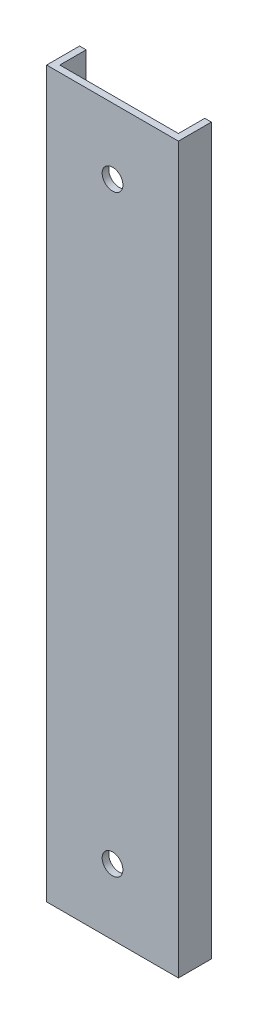
ISO-10303-21;
HEADER;
FILE_DESCRIPTION(('STEP AP214'),'2;1');
FILE_NAME('part.step','',(''),(''),'','','');
FILE_SCHEMA(('AUTOMOTIVE_DESIGN { 1 0 10303 214 1 1 1 1 }'));
ENDSEC;
DATA;
#1=APPLICATION_CONTEXT('core data for automotive mechanical design processes');
#2=APPLICATION_PROTOCOL_DEFINITION('international standard','automotive_design',2000,#1);
#3=PRODUCT_CONTEXT('',#1,'mechanical');
#4=PRODUCT('Part','Part','',(#3));
#5=PRODUCT_RELATED_PRODUCT_CATEGORY('part','',(#4));
#6=PRODUCT_DEFINITION_FORMATION('','',#4);
#7=PRODUCT_DEFINITION_CONTEXT('part definition',#1,'design');
#8=PRODUCT_DEFINITION('design','',#6,#7);
#9=PRODUCT_DEFINITION_SHAPE('','',#8);
#10=(LENGTH_UNIT() NAMED_UNIT(*) SI_UNIT(.MILLI.,.METRE.));
#11=(NAMED_UNIT(*) PLANE_ANGLE_UNIT() SI_UNIT($,.RADIAN.));
#12=(NAMED_UNIT(*) SI_UNIT($,.STERADIAN.) SOLID_ANGLE_UNIT());
#13=UNCERTAINTY_MEASURE_WITH_UNIT(LENGTH_MEASURE(1.E-05),#10,'distance_accuracy_value','');
#14=(GEOMETRIC_REPRESENTATION_CONTEXT(3) GLOBAL_UNCERTAINTY_ASSIGNED_CONTEXT((#13)) GLOBAL_UNIT_ASSIGNED_CONTEXT((#10,
#11,#12)) REPRESENTATION_CONTEXT('',''));
#15=CARTESIAN_POINT('',(0.,0.,0.));
#16=DIRECTION('',(0.,0.,1.));
#17=DIRECTION('',(1.,0.,0.));
#18=AXIS2_PLACEMENT_3D('',#15,#16,#17);
#19=CARTESIAN_POINT('',(22.86,279.4,-12.7));
#20=DIRECTION('',(0.,0.,1.));
#21=DIRECTION('',(1.,0.,0.));
#22=AXIS2_PLACEMENT_3D('',#19,#20,#21);
#23=PLANE('',#22);
#24=DIRECTION('',(-1.,0.,0.));
#25=VECTOR('',#24,1.);
#26=CARTESIAN_POINT('',(22.86,0.,-12.7));
#27=LINE('',#26,#25);
#28=CARTESIAN_POINT('',(25.4,0.,-12.7));
#29=VERTEX_POINT('',#28);
#30=CARTESIAN_POINT('',(22.86,0.,-12.7));
#31=VERTEX_POINT('',#30);
#32=EDGE_CURVE('E140',#29,#31,#27,.T.);
#33=ORIENTED_EDGE('',*,*,#32,.T.);
#34=DIRECTION('',(0.,-1.,0.));
#35=VECTOR('',#34,1.);
#36=CARTESIAN_POINT('',(22.86,279.4,-12.7));
#37=LINE('',#36,#35);
#38=CARTESIAN_POINT('',(22.86,279.4,-12.7));
#39=VERTEX_POINT('',#38);
#40=EDGE_CURVE('E11',#39,#31,#37,.T.);
#41=ORIENTED_EDGE('',*,*,#40,.F.);
#42=DIRECTION('',(-1.,0.,0.));
#43=VECTOR('',#42,1.);
#44=CARTESIAN_POINT('',(22.86,279.4,-12.7));
#45=LINE('',#44,#43);
#46=CARTESIAN_POINT('',(25.4,279.4,-12.7));
#47=VERTEX_POINT('',#46);
#48=EDGE_CURVE('E163',#47,#39,#45,.T.);
#49=ORIENTED_EDGE('',*,*,#48,.F.);
#50=DIRECTION('',(0.,-1.,0.));
#51=VECTOR('',#50,1.);
#52=CARTESIAN_POINT('',(25.4,279.4,-12.7));
#53=LINE('',#52,#51);
#54=EDGE_CURVE('E136',#47,#29,#53,.T.);
#55=ORIENTED_EDGE('',*,*,#54,.T.);
#56=EDGE_LOOP('',(#33,#41,#49,#55));
#57=FACE_BOUND('',#56,.T.);
#58=ADVANCED_FACE('F39',(#57),#23,.F.);
#59=CARTESIAN_POINT('',(22.86,279.4,-2.54));
#60=DIRECTION('',(1.,0.,0.));
#61=DIRECTION('',(0.,0.,-1.));
#62=AXIS2_PLACEMENT_3D('',#59,#60,#61);
#63=PLANE('',#62);
#64=DIRECTION('',(0.,0.,1.));
#65=VECTOR('',#64,1.);
#66=CARTESIAN_POINT('',(22.86,0.,-2.54));
#67=LINE('',#66,#65);
#68=CARTESIAN_POINT('',(22.86,0.,-2.54));
#69=VERTEX_POINT('',#68);
#70=EDGE_CURVE('E144',#31,#69,#67,.T.);
#71=ORIENTED_EDGE('',*,*,#70,.T.);
#72=DIRECTION('',(0.,-1.,0.));
#73=VECTOR('',#72,1.);
#74=CARTESIAN_POINT('',(22.86,279.4,-2.54));
#75=LINE('',#74,#73);
#76=CARTESIAN_POINT('',(22.86,279.4,-2.54));
#77=VERTEX_POINT('',#76);
#78=EDGE_CURVE('E48',#77,#69,#75,.T.);
#79=ORIENTED_EDGE('',*,*,#78,.F.);
#80=DIRECTION('',(0.,0.,1.));
#81=VECTOR('',#80,1.);
#82=CARTESIAN_POINT('',(22.86,279.4,-2.54));
#83=LINE('',#82,#81);
#84=EDGE_CURVE('E99',#39,#77,#83,.T.);
#85=ORIENTED_EDGE('',*,*,#84,.F.);
#86=ORIENTED_EDGE('',*,*,#40,.T.);
#87=EDGE_LOOP('',(#71,#79,#85,#86));
#88=FACE_BOUND('',#87,.T.);
#89=ADVANCED_FACE('F239',(#88),#63,.F.);
#90=CARTESIAN_POINT('',(-22.86,279.4,-2.54));
#91=DIRECTION('',(0.,0.,1.));
#92=DIRECTION('',(1.,0.,0.));
#93=AXIS2_PLACEMENT_3D('',#90,#91,#92);
#94=PLANE('',#93);
#95=CARTESIAN_POINT('',(0.,25.4,-2.54));
#96=DIRECTION('',(0.,0.,1.));
#97=DIRECTION('',(1.,0.,0.));
#98=AXIS2_PLACEMENT_3D('',#95,#96,#97);
#99=CIRCLE('',#98,4.0000047);
#100=CARTESIAN_POINT('',(4.0000047,25.4,-2.54));
#101=VERTEX_POINT('',#100);
#102=EDGE_CURVE('E145',#101,#101,#99,.F.);
#103=ORIENTED_EDGE('',*,*,#102,.F.);
#104=EDGE_LOOP('',(#103));
#105=FACE_BOUND('',#104,.T.);
#106=CARTESIAN_POINT('',(0.,254.,-2.54));
#107=DIRECTION('',(0.,0.,1.));
#108=DIRECTION('',(1.,0.,0.));
#109=AXIS2_PLACEMENT_3D('',#106,#107,#108);
#110=CIRCLE('',#109,4.00000470000001);
#111=CARTESIAN_POINT('',(4.00000470000001,254.,-2.54));
#112=VERTEX_POINT('',#111);
#113=EDGE_CURVE('E207',#112,#112,#110,.F.);
#114=ORIENTED_EDGE('',*,*,#113,.F.);
#115=EDGE_LOOP('',(#114));
#116=FACE_BOUND('',#115,.T.);
#117=DIRECTION('',(-1.,0.,0.));
#118=VECTOR('',#117,1.);
#119=CARTESIAN_POINT('',(-22.86,0.,-2.54));
#120=LINE('',#119,#118);
#121=CARTESIAN_POINT('',(-22.86,0.,-2.54));
#122=VERTEX_POINT('',#121);
#123=EDGE_CURVE('E148',#69,#122,#120,.T.);
#124=ORIENTED_EDGE('',*,*,#123,.T.);
#125=DIRECTION('',(0.,-1.,0.));
#126=VECTOR('',#125,1.);
#127=CARTESIAN_POINT('',(-22.86,279.4,-2.54));
#128=LINE('',#127,#126);
#129=CARTESIAN_POINT('',(-22.86,279.4,-2.54));
#130=VERTEX_POINT('',#129);
#131=EDGE_CURVE('E174',#130,#122,#128,.T.);
#132=ORIENTED_EDGE('',*,*,#131,.F.);
#133=DIRECTION('',(-1.,0.,0.));
#134=VECTOR('',#133,1.);
#135=CARTESIAN_POINT('',(-22.86,279.4,-2.54));
#136=LINE('',#135,#134);
#137=EDGE_CURVE('E184',#77,#130,#136,.T.);
#138=ORIENTED_EDGE('',*,*,#137,.F.);
#139=ORIENTED_EDGE('',*,*,#78,.T.);
#140=EDGE_LOOP('',(#124,#132,#138,#139));
#141=FACE_BOUND('',#140,.T.);
#142=ADVANCED_FACE('F182',(#105,#116,#141),#94,.F.);
#143=CARTESIAN_POINT('',(-22.86,279.4,-2.54));
#144=DIRECTION('',(-1.,0.,0.));
#145=DIRECTION('',(0.,0.,1.));
#146=AXIS2_PLACEMENT_3D('',#143,#144,#145);
#147=PLANE('',#146);
#148=DIRECTION('',(0.,0.,-1.));
#149=VECTOR('',#148,1.);
#150=CARTESIAN_POINT('',(-22.86,0.,-2.54));
#151=LINE('',#150,#149);
#152=CARTESIAN_POINT('',(-22.86,0.,-12.7));
#153=VERTEX_POINT('',#152);
#154=EDGE_CURVE('E151',#122,#153,#151,.T.);
#155=ORIENTED_EDGE('',*,*,#154,.T.);
#156=DIRECTION('',(0.,-1.,0.));
#157=VECTOR('',#156,1.);
#158=CARTESIAN_POINT('',(-22.86,279.4,-12.7));
#159=LINE('',#158,#157);
#160=CARTESIAN_POINT('',(-22.86,279.4,-12.7));
#161=VERTEX_POINT('',#160);
#162=EDGE_CURVE('E170',#161,#153,#159,.T.);
#163=ORIENTED_EDGE('',*,*,#162,.F.);
#164=DIRECTION('',(0.,0.,-1.));
#165=VECTOR('',#164,1.);
#166=CARTESIAN_POINT('',(-22.86,279.4,-2.54));
#167=LINE('',#166,#165);
#168=EDGE_CURVE('E197',#130,#161,#167,.T.);
#169=ORIENTED_EDGE('',*,*,#168,.F.);
#170=ORIENTED_EDGE('',*,*,#131,.T.);
#171=EDGE_LOOP('',(#155,#163,#169,#170));
#172=FACE_BOUND('',#171,.T.);
#173=ADVANCED_FACE('F192',(#172),#147,.F.);
#174=CARTESIAN_POINT('',(-25.4,279.4,-12.7));
#175=DIRECTION('',(0.,0.,1.));
#176=DIRECTION('',(1.,0.,0.));
#177=AXIS2_PLACEMENT_3D('',#174,#175,#176);
#178=PLANE('',#177);
#179=DIRECTION('',(-1.,0.,0.));
#180=VECTOR('',#179,1.);
#181=CARTESIAN_POINT('',(-25.4,0.,-12.7));
#182=LINE('',#181,#180);
#183=CARTESIAN_POINT('',(-25.4,0.,-12.7));
#184=VERTEX_POINT('',#183);
#185=EDGE_CURVE('E154',#153,#184,#182,.T.);
#186=ORIENTED_EDGE('',*,*,#185,.T.);
#187=DIRECTION('',(0.,-1.,0.));
#188=VECTOR('',#187,1.);
#189=CARTESIAN_POINT('',(-25.4,279.4,-12.7));
#190=LINE('',#189,#188);
#191=CARTESIAN_POINT('',(-25.4,279.4,-12.7));
#192=VERTEX_POINT('',#191);
#193=EDGE_CURVE('E129',#192,#184,#190,.T.);
#194=ORIENTED_EDGE('',*,*,#193,.F.);
#195=DIRECTION('',(-1.,0.,0.));
#196=VECTOR('',#195,1.);
#197=CARTESIAN_POINT('',(-25.4,279.4,-12.7));
#198=LINE('',#197,#196);
#199=EDGE_CURVE('E118',#161,#192,#198,.T.);
#200=ORIENTED_EDGE('',*,*,#199,.F.);
#201=ORIENTED_EDGE('',*,*,#162,.T.);
#202=EDGE_LOOP('',(#186,#194,#200,#201));
#203=FACE_BOUND('',#202,.T.);
#204=ADVANCED_FACE('F195',(#203),#178,.F.);
#205=CARTESIAN_POINT('',(-25.4,279.4,0.));
#206=DIRECTION('',(1.,0.,0.));
#207=DIRECTION('',(0.,0.,-1.));
#208=AXIS2_PLACEMENT_3D('',#205,#206,#207);
#209=PLANE('',#208);
#210=DIRECTION('',(0.,0.,1.));
#211=VECTOR('',#210,1.);
#212=CARTESIAN_POINT('',(-25.4,0.,0.));
#213=LINE('',#212,#211);
#214=CARTESIAN_POINT('',(-25.4,0.,0.));
#215=VERTEX_POINT('',#214);
#216=EDGE_CURVE('E127',#184,#215,#213,.T.);
#217=ORIENTED_EDGE('',*,*,#216,.T.);
#218=DIRECTION('',(0.,-1.,0.));
#219=VECTOR('',#218,1.);
#220=CARTESIAN_POINT('',(-25.4,279.4,0.));
#221=LINE('',#220,#219);
#222=CARTESIAN_POINT('',(-25.4,279.4,0.));
#223=VERTEX_POINT('',#222);
#224=EDGE_CURVE('E124',#223,#215,#221,.T.);
#225=ORIENTED_EDGE('',*,*,#224,.F.);
#226=DIRECTION('',(0.,0.,1.));
#227=VECTOR('',#226,1.);
#228=CARTESIAN_POINT('',(-25.4,279.4,0.));
#229=LINE('',#228,#227);
#230=EDGE_CURVE('E112',#192,#223,#229,.T.);
#231=ORIENTED_EDGE('',*,*,#230,.F.);
#232=ORIENTED_EDGE('',*,*,#193,.T.);
#233=EDGE_LOOP('',(#217,#225,#231,#232));
#234=FACE_BOUND('',#233,.T.);
#235=ADVANCED_FACE('F125',(#234),#209,.F.);
#236=CARTESIAN_POINT('',(-25.4,279.4,0.));
#237=DIRECTION('',(0.,0.,-1.));
#238=DIRECTION('',(-1.,0.,0.));
#239=AXIS2_PLACEMENT_3D('',#236,#237,#238);
#240=PLANE('',#239);
#241=CARTESIAN_POINT('',(0.,25.4,0.));
#242=DIRECTION('',(0.,0.,1.));
#243=DIRECTION('',(1.,0.,0.));
#244=AXIS2_PLACEMENT_3D('',#241,#242,#243);
#245=CIRCLE('',#244,4.0000047);
#246=CARTESIAN_POINT('',(4.0000047,25.4,0.));
#247=VERTEX_POINT('',#246);
#248=EDGE_CURVE('E211',#247,#247,#245,.T.);
#249=ORIENTED_EDGE('',*,*,#248,.F.);
#250=EDGE_LOOP('',(#249));
#251=FACE_BOUND('',#250,.T.);
#252=CARTESIAN_POINT('',(0.,254.,0.));
#253=DIRECTION('',(0.,0.,1.));
#254=DIRECTION('',(1.,0.,0.));
#255=AXIS2_PLACEMENT_3D('',#252,#253,#254);
#256=CIRCLE('',#255,4.00000470000001);
#257=CARTESIAN_POINT('',(4.00000470000001,254.,0.));
#258=VERTEX_POINT('',#257);
#259=EDGE_CURVE('E212',#258,#258,#256,.T.);
#260=ORIENTED_EDGE('',*,*,#259,.F.);
#261=EDGE_LOOP('',(#260));
#262=FACE_BOUND('',#261,.T.);
#263=DIRECTION('',(1.,0.,0.));
#264=VECTOR('',#263,1.);
#265=CARTESIAN_POINT('',(-25.4,0.,0.));
#266=LINE('',#265,#264);
#267=CARTESIAN_POINT('',(25.4,0.,0.));
#268=VERTEX_POINT('',#267);
#269=EDGE_CURVE('E85',#215,#268,#266,.T.);
#270=ORIENTED_EDGE('',*,*,#269,.T.);
#271=DIRECTION('',(0.,-1.,0.));
#272=VECTOR('',#271,1.);
#273=CARTESIAN_POINT('',(25.4,279.4,0.));
#274=LINE('',#273,#272);
#275=CARTESIAN_POINT('',(25.4,279.4,0.));
#276=VERTEX_POINT('',#275);
#277=EDGE_CURVE('E130',#276,#268,#274,.T.);
#278=ORIENTED_EDGE('',*,*,#277,.F.);
#279=DIRECTION('',(1.,0.,0.));
#280=VECTOR('',#279,1.);
#281=CARTESIAN_POINT('',(-25.4,279.4,0.));
#282=LINE('',#281,#280);
#283=EDGE_CURVE('E116',#223,#276,#282,.T.);
#284=ORIENTED_EDGE('',*,*,#283,.F.);
#285=ORIENTED_EDGE('',*,*,#224,.T.);
#286=EDGE_LOOP('',(#270,#278,#284,#285));
#287=FACE_BOUND('',#286,.T.);
#288=ADVANCED_FACE('F132',(#251,#262,#287),#240,.F.);
#289=CARTESIAN_POINT('',(25.4,279.4,0.));
#290=DIRECTION('',(-1.,0.,0.));
#291=DIRECTION('',(0.,0.,1.));
#292=AXIS2_PLACEMENT_3D('',#289,#290,#291);
#293=PLANE('',#292);
#294=DIRECTION('',(0.,0.,-1.));
#295=VECTOR('',#294,1.);
#296=CARTESIAN_POINT('',(25.4,0.,0.));
#297=LINE('',#296,#295);
#298=EDGE_CURVE('E91',#268,#29,#297,.T.);
#299=ORIENTED_EDGE('',*,*,#298,.T.);
#300=ORIENTED_EDGE('',*,*,#54,.F.);
#301=DIRECTION('',(0.,0.,-1.));
#302=VECTOR('',#301,1.);
#303=CARTESIAN_POINT('',(25.4,279.4,0.));
#304=LINE('',#303,#302);
#305=EDGE_CURVE('E56',#276,#47,#304,.T.);
#306=ORIENTED_EDGE('',*,*,#305,.F.);
#307=ORIENTED_EDGE('',*,*,#277,.T.);
#308=EDGE_LOOP('',(#299,#300,#306,#307));
#309=FACE_BOUND('',#308,.T.);
#310=ADVANCED_FACE('F228',(#309),#293,.F.);
#311=CARTESIAN_POINT('',(0.,279.4,0.));
#312=DIRECTION('',(0.,1.,0.));
#313=DIRECTION('',(0.,0.,1.));
#314=AXIS2_PLACEMENT_3D('',#311,#312,#313);
#315=PLANE('',#314);
#316=ORIENTED_EDGE('',*,*,#48,.T.);
#317=ORIENTED_EDGE('',*,*,#84,.T.);
#318=ORIENTED_EDGE('',*,*,#137,.T.);
#319=ORIENTED_EDGE('',*,*,#168,.T.);
#320=ORIENTED_EDGE('',*,*,#199,.T.);
#321=ORIENTED_EDGE('',*,*,#230,.T.);
#322=ORIENTED_EDGE('',*,*,#283,.T.);
#323=ORIENTED_EDGE('',*,*,#305,.T.);
#324=EDGE_LOOP('',(#316,#317,#318,#319,#320,#321,#322,#323));
#325=FACE_BOUND('',#324,.T.);
#326=ADVANCED_FACE('F114',(#325),#315,.T.);
#327=CARTESIAN_POINT('',(0.,0.,0.));
#328=DIRECTION('',(0.,1.,0.));
#329=DIRECTION('',(0.,0.,1.));
#330=AXIS2_PLACEMENT_3D('',#327,#328,#329);
#331=PLANE('',#330);
#332=ORIENTED_EDGE('',*,*,#32,.F.);
#333=ORIENTED_EDGE('',*,*,#298,.F.);
#334=ORIENTED_EDGE('',*,*,#269,.F.);
#335=ORIENTED_EDGE('',*,*,#216,.F.);
#336=ORIENTED_EDGE('',*,*,#185,.F.);
#337=ORIENTED_EDGE('',*,*,#154,.F.);
#338=ORIENTED_EDGE('',*,*,#123,.F.);
#339=ORIENTED_EDGE('',*,*,#70,.F.);
#340=EDGE_LOOP('',(#332,#333,#334,#335,#336,#337,#338,#339));
#341=FACE_BOUND('',#340,.T.);
#342=ADVANCED_FACE('F188',(#341),#331,.F.);
#343=CARTESIAN_POINT('',(0.,254.,-12.701));
#344=DIRECTION('',(0.,0.,1.));
#345=DIRECTION('',(1.,0.,0.));
#346=AXIS2_PLACEMENT_3D('',#343,#344,#345);
#347=CYLINDRICAL_SURFACE('',#346,4.00000470000001);
#348=ORIENTED_EDGE('',*,*,#259,.T.);
#349=EDGE_LOOP('',(#348));
#350=FACE_BOUND('',#349,.T.);
#351=ORIENTED_EDGE('',*,*,#113,.T.);
#352=EDGE_LOOP('',(#351));
#353=FACE_BOUND('',#352,.T.);
#354=ADVANCED_FACE('F232',(#350,#353),#347,.F.);
#355=CARTESIAN_POINT('',(0.,25.4,-12.701));
#356=DIRECTION('',(0.,0.,1.));
#357=DIRECTION('',(1.,0.,0.));
#358=AXIS2_PLACEMENT_3D('',#355,#356,#357);
#359=CYLINDRICAL_SURFACE('',#358,4.0000047);
#360=ORIENTED_EDGE('',*,*,#248,.T.);
#361=EDGE_LOOP('',(#360));
#362=FACE_BOUND('',#361,.T.);
#363=ORIENTED_EDGE('',*,*,#102,.T.);
#364=EDGE_LOOP('',(#363));
#365=FACE_BOUND('',#364,.T.);
#366=ADVANCED_FACE('F223',(#362,#365),#359,.F.);
#367=CLOSED_SHELL('',(#58,#89,#142,#173,#204,#235,#288,#310,#326,#342,#354,#366));
#368=MANIFOLD_SOLID_BREP('B2',#367);
#369=ADVANCED_BREP_SHAPE_REPRESENTATION('',(#18,#368),#14);
#370=SHAPE_DEFINITION_REPRESENTATION(#9,#369);
ENDSEC;
END-ISO-10303-21;
